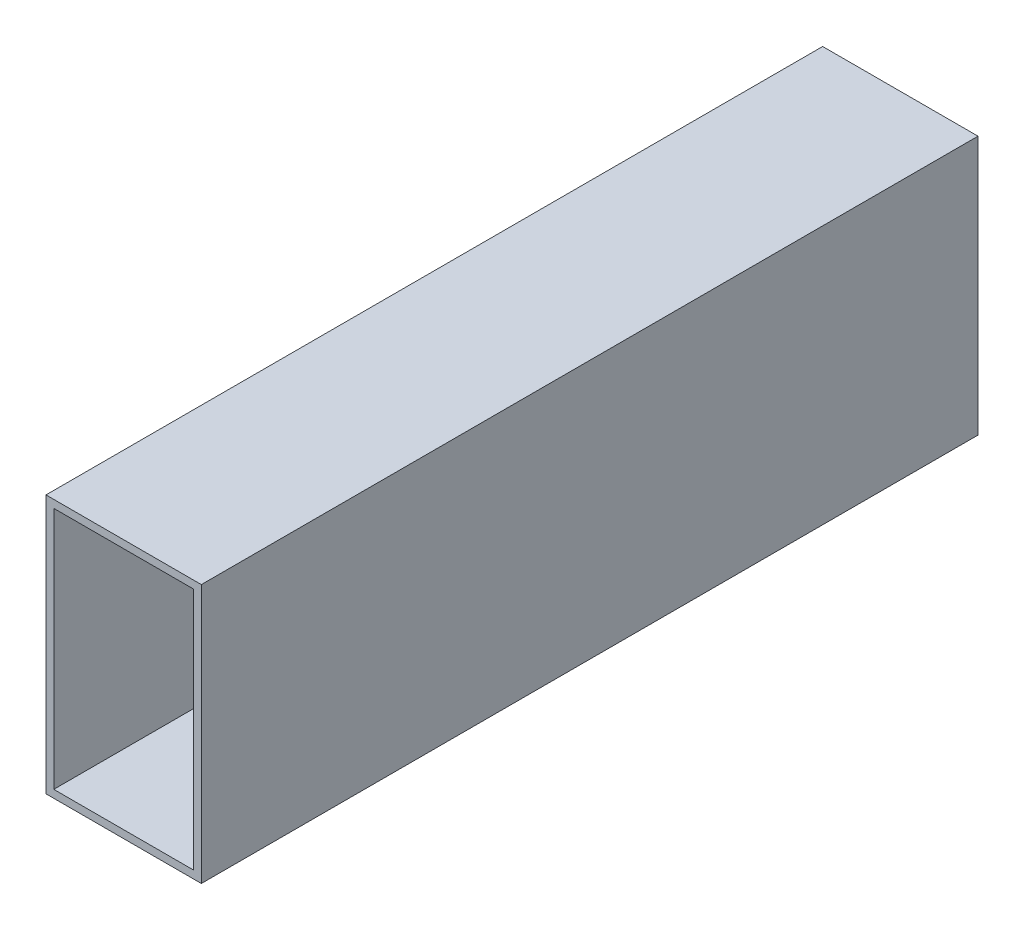
ISO-10303-21;
HEADER;
FILE_DESCRIPTION(('STEP AP214'),'2;1');
FILE_NAME('part.step','',(''),(''),'','','');
FILE_SCHEMA(('AUTOMOTIVE_DESIGN { 1 0 10303 214 1 1 1 1 }'));
ENDSEC;
DATA;
#1=APPLICATION_CONTEXT('core data for automotive mechanical design processes');
#2=APPLICATION_PROTOCOL_DEFINITION('international standard','automotive_design',2000,#1);
#3=PRODUCT_CONTEXT('',#1,'mechanical');
#4=PRODUCT('Part','Part','',(#3));
#5=PRODUCT_RELATED_PRODUCT_CATEGORY('part','',(#4));
#6=PRODUCT_DEFINITION_FORMATION('','',#4);
#7=PRODUCT_DEFINITION_CONTEXT('part definition',#1,'design');
#8=PRODUCT_DEFINITION('design','',#6,#7);
#9=PRODUCT_DEFINITION_SHAPE('','',#8);
#10=(LENGTH_UNIT() NAMED_UNIT(*) SI_UNIT(.MILLI.,.METRE.));
#11=(NAMED_UNIT(*) PLANE_ANGLE_UNIT() SI_UNIT($,.RADIAN.));
#12=(NAMED_UNIT(*) SI_UNIT($,.STERADIAN.) SOLID_ANGLE_UNIT());
#13=UNCERTAINTY_MEASURE_WITH_UNIT(LENGTH_MEASURE(1.E-05),#10,'distance_accuracy_value','');
#14=(GEOMETRIC_REPRESENTATION_CONTEXT(3) GLOBAL_UNCERTAINTY_ASSIGNED_CONTEXT((#13)) GLOBAL_UNIT_ASSIGNED_CONTEXT((#10,
#11,#12)) REPRESENTATION_CONTEXT('',''));
#15=CARTESIAN_POINT('',(0.,0.,0.));
#16=DIRECTION('',(0.,0.,1.));
#17=DIRECTION('',(1.,0.,0.));
#18=AXIS2_PLACEMENT_3D('',#15,#16,#17);
#19=CARTESIAN_POINT('',(0.,0.,150.));
#20=DIRECTION('',(0.,0.,-1.));
#21=DIRECTION('',(-1.,0.,0.));
#22=AXIS2_PLACEMENT_3D('',#19,#20,#21);
#23=PLANE('',#22);
#24=DIRECTION('',(0.,-1.,0.));
#25=VECTOR('',#24,1.);
#26=CARTESIAN_POINT('',(0.,0.,150.));
#27=LINE('',#26,#25);
#28=CARTESIAN_POINT('',(0.,50.,150.));
#29=VERTEX_POINT('',#28);
#30=CARTESIAN_POINT('',(0.,0.,150.));
#31=VERTEX_POINT('',#30);
#32=EDGE_CURVE('E136',#29,#31,#27,.T.);
#33=ORIENTED_EDGE('',*,*,#32,.T.);
#34=DIRECTION('',(1.,0.,0.));
#35=VECTOR('',#34,1.);
#36=CARTESIAN_POINT('',(0.,0.,150.));
#37=LINE('',#36,#35);
#38=CARTESIAN_POINT('',(30.,0.,150.));
#39=VERTEX_POINT('',#38);
#40=EDGE_CURVE('E139',#31,#39,#37,.T.);
#41=ORIENTED_EDGE('',*,*,#40,.T.);
#42=DIRECTION('',(0.,1.,0.));
#43=VECTOR('',#42,1.);
#44=CARTESIAN_POINT('',(30.,0.,150.));
#45=LINE('',#44,#43);
#46=CARTESIAN_POINT('',(30.,50.,150.));
#47=VERTEX_POINT('',#46);
#48=EDGE_CURVE('E142',#39,#47,#45,.T.);
#49=ORIENTED_EDGE('',*,*,#48,.T.);
#50=DIRECTION('',(-1.,0.,0.));
#51=VECTOR('',#50,1.);
#52=CARTESIAN_POINT('',(0.,50.,150.));
#53=LINE('',#52,#51);
#54=EDGE_CURVE('E144',#47,#29,#53,.T.);
#55=ORIENTED_EDGE('',*,*,#54,.T.);
#56=EDGE_LOOP('',(#33,#41,#49,#55));
#57=FACE_BOUND('',#56,.T.);
#58=DIRECTION('',(0.,-1.,0.));
#59=VECTOR('',#58,1.);
#60=CARTESIAN_POINT('',(1.5,1.5,150.));
#61=LINE('',#60,#59);
#62=CARTESIAN_POINT('',(1.5,48.5,150.));
#63=VERTEX_POINT('',#62);
#64=CARTESIAN_POINT('',(1.5,1.5,150.));
#65=VERTEX_POINT('',#64);
#66=EDGE_CURVE('E100',#63,#65,#61,.T.);
#67=ORIENTED_EDGE('',*,*,#66,.F.);
#68=DIRECTION('',(-1.,0.,0.));
#69=VECTOR('',#68,1.);
#70=CARTESIAN_POINT('',(1.5,48.5,150.));
#71=LINE('',#70,#69);
#72=CARTESIAN_POINT('',(28.5,48.5,150.));
#73=VERTEX_POINT('',#72);
#74=EDGE_CURVE('E122',#73,#63,#71,.T.);
#75=ORIENTED_EDGE('',*,*,#74,.F.);
#76=DIRECTION('',(0.,1.,0.));
#77=VECTOR('',#76,1.);
#78=CARTESIAN_POINT('',(28.5,1.5,150.));
#79=LINE('',#78,#77);
#80=CARTESIAN_POINT('',(28.5,1.5,150.));
#81=VERTEX_POINT('',#80);
#82=EDGE_CURVE('E120',#81,#73,#79,.T.);
#83=ORIENTED_EDGE('',*,*,#82,.F.);
#84=DIRECTION('',(1.,0.,0.));
#85=VECTOR('',#84,1.);
#86=CARTESIAN_POINT('',(1.5,1.5,150.));
#87=LINE('',#86,#85);
#88=EDGE_CURVE('E108',#65,#81,#87,.T.);
#89=ORIENTED_EDGE('',*,*,#88,.F.);
#90=EDGE_LOOP('',(#67,#75,#83,#89));
#91=FACE_BOUND('',#90,.T.);
#92=ADVANCED_FACE('F35',(#57,#91),#23,.F.);
#93=CARTESIAN_POINT('',(0.,0.,0.));
#94=DIRECTION('',(0.,0.,-1.));
#95=DIRECTION('',(-1.,0.,0.));
#96=AXIS2_PLACEMENT_3D('',#93,#94,#95);
#97=PLANE('',#96);
#98=DIRECTION('',(0.,-1.,0.));
#99=VECTOR('',#98,1.);
#100=CARTESIAN_POINT('',(0.,0.,0.));
#101=LINE('',#100,#99);
#102=CARTESIAN_POINT('',(0.,50.,0.));
#103=VERTEX_POINT('',#102);
#104=CARTESIAN_POINT('',(0.,0.,0.));
#105=VERTEX_POINT('',#104);
#106=EDGE_CURVE('E116',#103,#105,#101,.T.);
#107=ORIENTED_EDGE('',*,*,#106,.F.);
#108=DIRECTION('',(-1.,0.,0.));
#109=VECTOR('',#108,1.);
#110=CARTESIAN_POINT('',(0.,50.,0.));
#111=LINE('',#110,#109);
#112=CARTESIAN_POINT('',(30.,50.,0.));
#113=VERTEX_POINT('',#112);
#114=EDGE_CURVE('E140',#113,#103,#111,.T.);
#115=ORIENTED_EDGE('',*,*,#114,.F.);
#116=DIRECTION('',(0.,1.,0.));
#117=VECTOR('',#116,1.);
#118=CARTESIAN_POINT('',(30.,0.,0.));
#119=LINE('',#118,#117);
#120=CARTESIAN_POINT('',(30.,0.,0.));
#121=VERTEX_POINT('',#120);
#122=EDGE_CURVE('E151',#121,#113,#119,.T.);
#123=ORIENTED_EDGE('',*,*,#122,.F.);
#124=DIRECTION('',(1.,0.,0.));
#125=VECTOR('',#124,1.);
#126=CARTESIAN_POINT('',(0.,0.,0.));
#127=LINE('',#126,#125);
#128=EDGE_CURVE('E149',#105,#121,#127,.T.);
#129=ORIENTED_EDGE('',*,*,#128,.F.);
#130=EDGE_LOOP('',(#107,#115,#123,#129));
#131=FACE_BOUND('',#130,.T.);
#132=DIRECTION('',(-1.,0.,0.));
#133=VECTOR('',#132,1.);
#134=CARTESIAN_POINT('',(1.5,48.5,0.));
#135=LINE('',#134,#133);
#136=CARTESIAN_POINT('',(28.5,48.5,0.));
#137=VERTEX_POINT('',#136);
#138=CARTESIAN_POINT('',(1.5,48.5,0.));
#139=VERTEX_POINT('',#138);
#140=EDGE_CURVE('E109',#137,#139,#135,.T.);
#141=ORIENTED_EDGE('',*,*,#140,.T.);
#142=DIRECTION('',(0.,-1.,0.));
#143=VECTOR('',#142,1.);
#144=CARTESIAN_POINT('',(1.5,1.5,0.));
#145=LINE('',#144,#143);
#146=CARTESIAN_POINT('',(1.5,1.5,0.));
#147=VERTEX_POINT('',#146);
#148=EDGE_CURVE('E58',#139,#147,#145,.T.);
#149=ORIENTED_EDGE('',*,*,#148,.T.);
#150=DIRECTION('',(1.,0.,0.));
#151=VECTOR('',#150,1.);
#152=CARTESIAN_POINT('',(1.5,1.5,0.));
#153=LINE('',#152,#151);
#154=CARTESIAN_POINT('',(28.5,1.5,0.));
#155=VERTEX_POINT('',#154);
#156=EDGE_CURVE('E115',#147,#155,#153,.T.);
#157=ORIENTED_EDGE('',*,*,#156,.T.);
#158=DIRECTION('',(0.,1.,0.));
#159=VECTOR('',#158,1.);
#160=CARTESIAN_POINT('',(28.5,1.5,0.));
#161=LINE('',#160,#159);
#162=EDGE_CURVE('E128',#155,#137,#161,.T.);
#163=ORIENTED_EDGE('',*,*,#162,.T.);
#164=EDGE_LOOP('',(#141,#149,#157,#163));
#165=FACE_BOUND('',#164,.T.);
#166=ADVANCED_FACE('F169',(#131,#165),#97,.T.);
#167=CARTESIAN_POINT('',(0.,0.,150.));
#168=DIRECTION('',(1.,0.,0.));
#169=DIRECTION('',(0.,0.,-1.));
#170=AXIS2_PLACEMENT_3D('',#167,#168,#169);
#171=PLANE('',#170);
#172=ORIENTED_EDGE('',*,*,#106,.T.);
#173=DIRECTION('',(0.,0.,-1.));
#174=VECTOR('',#173,1.);
#175=CARTESIAN_POINT('',(0.,0.,150.));
#176=LINE('',#175,#174);
#177=EDGE_CURVE('E11',#31,#105,#176,.T.);
#178=ORIENTED_EDGE('',*,*,#177,.F.);
#179=ORIENTED_EDGE('',*,*,#32,.F.);
#180=DIRECTION('',(0.,0.,-1.));
#181=VECTOR('',#180,1.);
#182=CARTESIAN_POINT('',(0.,50.,150.));
#183=LINE('',#182,#181);
#184=EDGE_CURVE('E146',#29,#103,#183,.T.);
#185=ORIENTED_EDGE('',*,*,#184,.T.);
#186=EDGE_LOOP('',(#172,#178,#179,#185));
#187=FACE_BOUND('',#186,.T.);
#188=ADVANCED_FACE('F37',(#187),#171,.F.);
#189=CARTESIAN_POINT('',(0.,0.,150.));
#190=DIRECTION('',(0.,1.,0.));
#191=DIRECTION('',(0.,0.,1.));
#192=AXIS2_PLACEMENT_3D('',#189,#190,#191);
#193=PLANE('',#192);
#194=ORIENTED_EDGE('',*,*,#128,.T.);
#195=DIRECTION('',(0.,0.,-1.));
#196=VECTOR('',#195,1.);
#197=CARTESIAN_POINT('',(30.,0.,150.));
#198=LINE('',#197,#196);
#199=EDGE_CURVE('E43',#39,#121,#198,.T.);
#200=ORIENTED_EDGE('',*,*,#199,.F.);
#201=ORIENTED_EDGE('',*,*,#40,.F.);
#202=ORIENTED_EDGE('',*,*,#177,.T.);
#203=EDGE_LOOP('',(#194,#200,#201,#202));
#204=FACE_BOUND('',#203,.T.);
#205=ADVANCED_FACE('F179',(#204),#193,.F.);
#206=CARTESIAN_POINT('',(30.,0.,150.));
#207=DIRECTION('',(-1.,0.,0.));
#208=DIRECTION('',(0.,0.,1.));
#209=AXIS2_PLACEMENT_3D('',#206,#207,#208);
#210=PLANE('',#209);
#211=ORIENTED_EDGE('',*,*,#122,.T.);
#212=DIRECTION('',(0.,0.,-1.));
#213=VECTOR('',#212,1.);
#214=CARTESIAN_POINT('',(30.,50.,150.));
#215=LINE('',#214,#213);
#216=EDGE_CURVE('E156',#47,#113,#215,.T.);
#217=ORIENTED_EDGE('',*,*,#216,.F.);
#218=ORIENTED_EDGE('',*,*,#48,.F.);
#219=ORIENTED_EDGE('',*,*,#199,.T.);
#220=EDGE_LOOP('',(#211,#217,#218,#219));
#221=FACE_BOUND('',#220,.T.);
#222=ADVANCED_FACE('F163',(#221),#210,.F.);
#223=CARTESIAN_POINT('',(0.,50.,150.));
#224=DIRECTION('',(0.,-1.,0.));
#225=DIRECTION('',(0.,0.,-1.));
#226=AXIS2_PLACEMENT_3D('',#223,#224,#225);
#227=PLANE('',#226);
#228=ORIENTED_EDGE('',*,*,#114,.T.);
#229=ORIENTED_EDGE('',*,*,#184,.F.);
#230=ORIENTED_EDGE('',*,*,#54,.F.);
#231=ORIENTED_EDGE('',*,*,#216,.T.);
#232=EDGE_LOOP('',(#228,#229,#230,#231));
#233=FACE_BOUND('',#232,.T.);
#234=ADVANCED_FACE('F173',(#233),#227,.F.);
#235=CARTESIAN_POINT('',(1.5,1.5,150.));
#236=DIRECTION('',(1.,0.,0.));
#237=DIRECTION('',(0.,0.,-1.));
#238=AXIS2_PLACEMENT_3D('',#235,#236,#237);
#239=PLANE('',#238);
#240=ORIENTED_EDGE('',*,*,#148,.F.);
#241=DIRECTION('',(0.,0.,-1.));
#242=VECTOR('',#241,1.);
#243=CARTESIAN_POINT('',(1.5,48.5,150.));
#244=LINE('',#243,#242);
#245=EDGE_CURVE('E104',#63,#139,#244,.T.);
#246=ORIENTED_EDGE('',*,*,#245,.F.);
#247=ORIENTED_EDGE('',*,*,#66,.T.);
#248=DIRECTION('',(0.,0.,-1.));
#249=VECTOR('',#248,1.);
#250=CARTESIAN_POINT('',(1.5,1.5,150.));
#251=LINE('',#250,#249);
#252=EDGE_CURVE('E103',#65,#147,#251,.T.);
#253=ORIENTED_EDGE('',*,*,#252,.T.);
#254=EDGE_LOOP('',(#240,#246,#247,#253));
#255=FACE_BOUND('',#254,.T.);
#256=ADVANCED_FACE('F102',(#255),#239,.T.);
#257=CARTESIAN_POINT('',(1.5,1.5,150.));
#258=DIRECTION('',(0.,1.,0.));
#259=DIRECTION('',(-1.,0.,0.));
#260=AXIS2_PLACEMENT_3D('',#257,#258,#259);
#261=PLANE('',#260);
#262=ORIENTED_EDGE('',*,*,#156,.F.);
#263=ORIENTED_EDGE('',*,*,#252,.F.);
#264=ORIENTED_EDGE('',*,*,#88,.T.);
#265=DIRECTION('',(0.,0.,-1.));
#266=VECTOR('',#265,1.);
#267=CARTESIAN_POINT('',(28.5,1.5,150.));
#268=LINE('',#267,#266);
#269=EDGE_CURVE('E117',#81,#155,#268,.T.);
#270=ORIENTED_EDGE('',*,*,#269,.T.);
#271=EDGE_LOOP('',(#262,#263,#264,#270));
#272=FACE_BOUND('',#271,.T.);
#273=ADVANCED_FACE('F112',(#272),#261,.T.);
#274=CARTESIAN_POINT('',(28.5,1.5,150.));
#275=DIRECTION('',(-1.,0.,0.));
#276=DIRECTION('',(0.,0.,1.));
#277=AXIS2_PLACEMENT_3D('',#274,#275,#276);
#278=PLANE('',#277);
#279=ORIENTED_EDGE('',*,*,#162,.F.);
#280=ORIENTED_EDGE('',*,*,#269,.F.);
#281=ORIENTED_EDGE('',*,*,#82,.T.);
#282=DIRECTION('',(0.,0.,-1.));
#283=VECTOR('',#282,1.);
#284=CARTESIAN_POINT('',(28.5,48.5,150.));
#285=LINE('',#284,#283);
#286=EDGE_CURVE('E50',#73,#137,#285,.T.);
#287=ORIENTED_EDGE('',*,*,#286,.T.);
#288=EDGE_LOOP('',(#279,#280,#281,#287));
#289=FACE_BOUND('',#288,.T.);
#290=ADVANCED_FACE('F202',(#289),#278,.T.);
#291=CARTESIAN_POINT('',(1.5,48.5,150.));
#292=DIRECTION('',(0.,-1.,0.));
#293=DIRECTION('',(0.,0.,-1.));
#294=AXIS2_PLACEMENT_3D('',#291,#292,#293);
#295=PLANE('',#294);
#296=ORIENTED_EDGE('',*,*,#140,.F.);
#297=ORIENTED_EDGE('',*,*,#286,.F.);
#298=ORIENTED_EDGE('',*,*,#74,.T.);
#299=ORIENTED_EDGE('',*,*,#245,.T.);
#300=EDGE_LOOP('',(#296,#297,#298,#299));
#301=FACE_BOUND('',#300,.T.);
#302=ADVANCED_FACE('F206',(#301),#295,.T.);
#303=CLOSED_SHELL('',(#92,#166,#188,#205,#222,#234,#256,#273,#290,#302));
#304=MANIFOLD_SOLID_BREP('B2',#303);
#305=ADVANCED_BREP_SHAPE_REPRESENTATION('',(#18,#304),#14);
#306=SHAPE_DEFINITION_REPRESENTATION(#9,#305);
ENDSEC;
END-ISO-10303-21;
